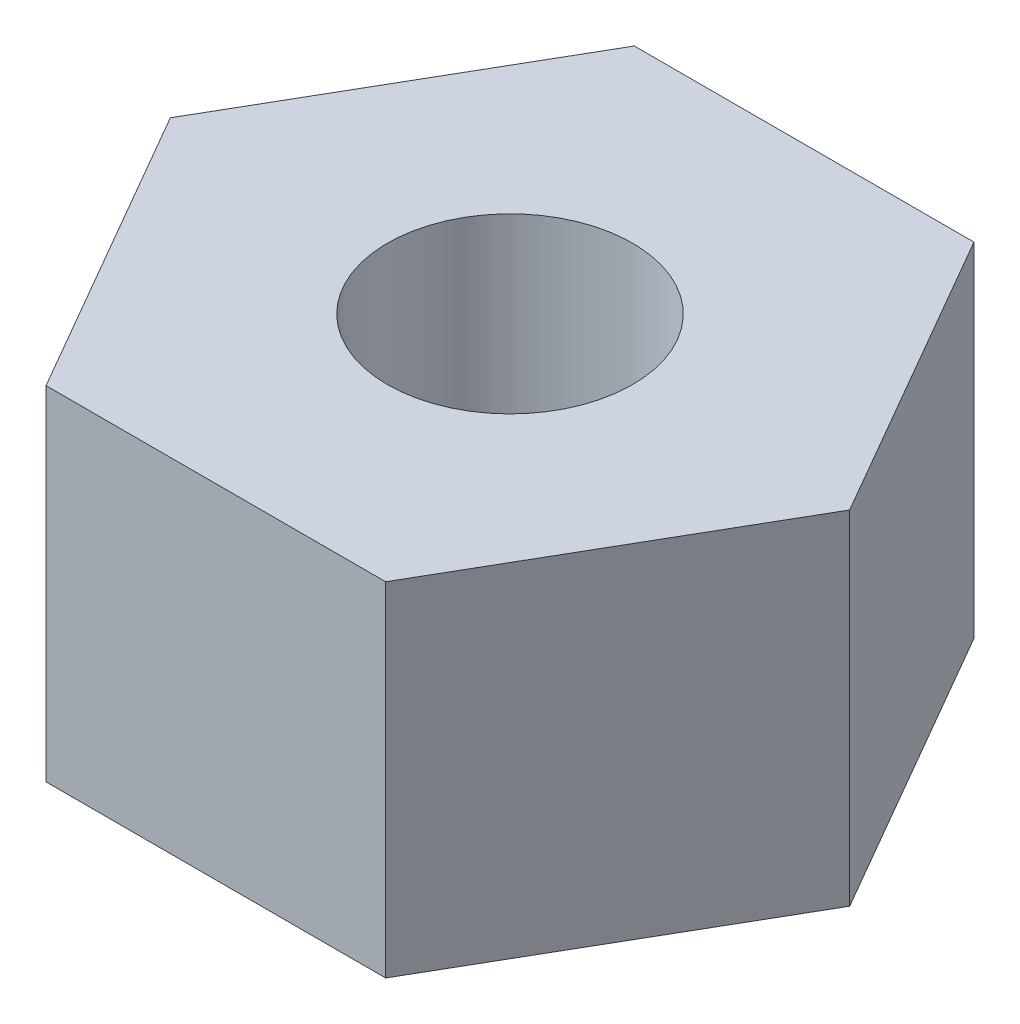
ISO-10303-21;
HEADER;
FILE_DESCRIPTION(('STEP AP214'),'2;1');
FILE_NAME('part.step','',(''),(''),'','','');
FILE_SCHEMA(('AUTOMOTIVE_DESIGN { 1 0 10303 214 1 1 1 1 }'));
ENDSEC;
DATA;
#1=APPLICATION_CONTEXT('core data for automotive mechanical design processes');
#2=APPLICATION_PROTOCOL_DEFINITION('international standard','automotive_design',2000,#1);
#3=PRODUCT_CONTEXT('',#1,'mechanical');
#4=PRODUCT('Part','Part','',(#3));
#5=PRODUCT_RELATED_PRODUCT_CATEGORY('part','',(#4));
#6=PRODUCT_DEFINITION_FORMATION('','',#4);
#7=PRODUCT_DEFINITION_CONTEXT('part definition',#1,'design');
#8=PRODUCT_DEFINITION('design','',#6,#7);
#9=PRODUCT_DEFINITION_SHAPE('','',#8);
#10=(LENGTH_UNIT() NAMED_UNIT(*) SI_UNIT(.MILLI.,.METRE.));
#11=(NAMED_UNIT(*) PLANE_ANGLE_UNIT() SI_UNIT($,.RADIAN.));
#12=(NAMED_UNIT(*) SI_UNIT($,.STERADIAN.) SOLID_ANGLE_UNIT());
#13=UNCERTAINTY_MEASURE_WITH_UNIT(LENGTH_MEASURE(1.E-05),#10,'distance_accuracy_value','');
#14=(GEOMETRIC_REPRESENTATION_CONTEXT(3) GLOBAL_UNCERTAINTY_ASSIGNED_CONTEXT((#13)) GLOBAL_UNIT_ASSIGNED_CONTEXT((#10,
#11,#12)) REPRESENTATION_CONTEXT('',''));
#15=CARTESIAN_POINT('',(0.,0.,0.));
#16=DIRECTION('',(0.,0.,1.));
#17=DIRECTION('',(1.,0.,0.));
#18=AXIS2_PLACEMENT_3D('',#15,#16,#17);
#19=CARTESIAN_POINT('',(0.,3.5,0.));
#20=DIRECTION('',(0.,1.,0.));
#21=DIRECTION('',(0.,0.,1.));
#22=AXIS2_PLACEMENT_3D('',#19,#20,#21);
#23=PLANE('',#22);
#24=DIRECTION('',(0.499999999999995,0.,-0.866025403784442));
#25=VECTOR('',#24,1.);
#26=CARTESIAN_POINT('',(1.73205080756891,3.5,2.99999999999998));
#27=LINE('',#26,#25);
#28=CARTESIAN_POINT('',(1.73205080756891,3.5,2.99999999999998));
#29=VERTEX_POINT('',#28);
#30=CARTESIAN_POINT('',(3.46410161513776,3.5,0.));
#31=VERTEX_POINT('',#30);
#32=EDGE_CURVE('E146',#29,#31,#27,.T.);
#33=ORIENTED_EDGE('',*,*,#32,.T.);
#34=DIRECTION('',(-0.500000000000001,0.,-0.866025403784438));
#35=VECTOR('',#34,1.);
#36=CARTESIAN_POINT('',(3.46410161513776,3.5,0.));
#37=LINE('',#36,#35);
#38=CARTESIAN_POINT('',(1.73205080756887,3.5,-3.00000000000001));
#39=VERTEX_POINT('',#38);
#40=EDGE_CURVE('E94',#31,#39,#37,.T.);
#41=ORIENTED_EDGE('',*,*,#40,.T.);
#42=DIRECTION('',(-1.,0.,0.));
#43=VECTOR('',#42,1.);
#44=CARTESIAN_POINT('',(1.73205080756887,3.5,-3.00000000000001));
#45=LINE('',#44,#43);
#46=CARTESIAN_POINT('',(-1.73205080756889,3.5,-2.99999999999999));
#47=VERTEX_POINT('',#46);
#48=EDGE_CURVE('E107',#39,#47,#45,.T.);
#49=ORIENTED_EDGE('',*,*,#48,.T.);
#50=DIRECTION('',(-0.499999999999995,0.,0.866025403784442));
#51=VECTOR('',#50,1.);
#52=CARTESIAN_POINT('',(-1.73205080756889,3.5,-2.99999999999999));
#53=LINE('',#52,#51);
#54=CARTESIAN_POINT('',(-3.46410161513776,3.5,0.));
#55=VERTEX_POINT('',#54);
#56=EDGE_CURVE('E101',#47,#55,#53,.T.);
#57=ORIENTED_EDGE('',*,*,#56,.T.);
#58=DIRECTION('',(0.500000000000007,0.,0.866025403784435));
#59=VECTOR('',#58,1.);
#60=CARTESIAN_POINT('',(-3.46410161513776,3.5,0.));
#61=LINE('',#60,#59);
#62=CARTESIAN_POINT('',(-1.73205080756885,3.5,3.00000000000002));
#63=VERTEX_POINT('',#62);
#64=EDGE_CURVE('E105',#55,#63,#61,.T.);
#65=ORIENTED_EDGE('',*,*,#64,.T.);
#66=DIRECTION('',(1.,0.,0.));
#67=VECTOR('',#66,1.);
#68=CARTESIAN_POINT('',(-1.73205080756885,3.5,3.00000000000002));
#69=LINE('',#68,#67);
#70=EDGE_CURVE('E57',#63,#29,#69,.T.);
#71=ORIENTED_EDGE('',*,*,#70,.T.);
#72=EDGE_LOOP('',(#33,#41,#49,#57,#65,#71));
#73=FACE_BOUND('',#72,.T.);
#74=CARTESIAN_POINT('',(0.,3.5,0.));
#75=DIRECTION('',(0.,1.,0.));
#76=DIRECTION('',(0.,0.,1.));
#77=AXIS2_PLACEMENT_3D('',#74,#75,#76);
#78=CIRCLE('',#77,1.25);
#79=CARTESIAN_POINT('',(0.,3.5,1.25));
#80=VERTEX_POINT('',#79);
#81=EDGE_CURVE('E134',#80,#80,#78,.T.);
#82=ORIENTED_EDGE('',*,*,#81,.F.);
#83=EDGE_LOOP('',(#82));
#84=FACE_BOUND('',#83,.T.);
#85=ADVANCED_FACE('F39',(#73,#84),#23,.T.);
#86=CARTESIAN_POINT('',(0.,0.,0.));
#87=DIRECTION('',(0.,1.,0.));
#88=DIRECTION('',(0.,0.,1.));
#89=AXIS2_PLACEMENT_3D('',#86,#87,#88);
#90=PLANE('',#89);
#91=DIRECTION('',(0.499999999999995,0.,-0.866025403784442));
#92=VECTOR('',#91,1.);
#93=CARTESIAN_POINT('',(1.73205080756891,0.,2.99999999999998));
#94=LINE('',#93,#92);
#95=CARTESIAN_POINT('',(1.73205080756891,0.,2.99999999999998));
#96=VERTEX_POINT('',#95);
#97=CARTESIAN_POINT('',(3.46410161513776,0.,0.));
#98=VERTEX_POINT('',#97);
#99=EDGE_CURVE('E129',#96,#98,#94,.T.);
#100=ORIENTED_EDGE('',*,*,#99,.F.);
#101=DIRECTION('',(1.,0.,0.));
#102=VECTOR('',#101,1.);
#103=CARTESIAN_POINT('',(-1.73205080756885,0.,3.00000000000002));
#104=LINE('',#103,#102);
#105=CARTESIAN_POINT('',(-1.73205080756885,0.,3.00000000000002));
#106=VERTEX_POINT('',#105);
#107=EDGE_CURVE('E86',#106,#96,#104,.T.);
#108=ORIENTED_EDGE('',*,*,#107,.F.);
#109=DIRECTION('',(0.500000000000007,0.,0.866025403784435));
#110=VECTOR('',#109,1.);
#111=CARTESIAN_POINT('',(-3.46410161513776,0.,0.));
#112=LINE('',#111,#110);
#113=CARTESIAN_POINT('',(-3.46410161513776,0.,0.));
#114=VERTEX_POINT('',#113);
#115=EDGE_CURVE('E80',#114,#106,#112,.T.);
#116=ORIENTED_EDGE('',*,*,#115,.F.);
#117=DIRECTION('',(-0.499999999999995,0.,0.866025403784442));
#118=VECTOR('',#117,1.);
#119=CARTESIAN_POINT('',(-1.73205080756889,0.,-2.99999999999999));
#120=LINE('',#119,#118);
#121=CARTESIAN_POINT('',(-1.73205080756889,0.,-2.99999999999999));
#122=VERTEX_POINT('',#121);
#123=EDGE_CURVE('E116',#122,#114,#120,.T.);
#124=ORIENTED_EDGE('',*,*,#123,.F.);
#125=DIRECTION('',(-1.,0.,0.));
#126=VECTOR('',#125,1.);
#127=CARTESIAN_POINT('',(1.73205080756887,0.,-3.00000000000001));
#128=LINE('',#127,#126);
#129=CARTESIAN_POINT('',(1.73205080756887,0.,-3.00000000000001));
#130=VERTEX_POINT('',#129);
#131=EDGE_CURVE('E137',#130,#122,#128,.T.);
#132=ORIENTED_EDGE('',*,*,#131,.F.);
#133=DIRECTION('',(-0.500000000000001,0.,-0.866025403784438));
#134=VECTOR('',#133,1.);
#135=CARTESIAN_POINT('',(3.46410161513776,0.,0.));
#136=LINE('',#135,#134);
#137=EDGE_CURVE('E133',#98,#130,#136,.T.);
#138=ORIENTED_EDGE('',*,*,#137,.F.);
#139=EDGE_LOOP('',(#100,#108,#116,#124,#132,#138));
#140=FACE_BOUND('',#139,.T.);
#141=CARTESIAN_POINT('',(0.,0.,0.));
#142=DIRECTION('',(0.,1.,0.));
#143=DIRECTION('',(0.,0.,1.));
#144=AXIS2_PLACEMENT_3D('',#141,#142,#143);
#145=CIRCLE('',#144,1.25);
#146=CARTESIAN_POINT('',(0.,0.,1.25));
#147=VERTEX_POINT('',#146);
#148=EDGE_CURVE('E243',#147,#147,#145,.T.);
#149=ORIENTED_EDGE('',*,*,#148,.T.);
#150=EDGE_LOOP('',(#149));
#151=FACE_BOUND('',#150,.T.);
#152=ADVANCED_FACE('F159',(#140,#151),#90,.F.);
#153=CARTESIAN_POINT('',(1.73205080756891,3.5,2.99999999999998));
#154=DIRECTION('',(-0.866025403784442,0.,-0.499999999999995));
#155=DIRECTION('',(-0.499999999999995,0.,0.866025403784442));
#156=AXIS2_PLACEMENT_3D('',#153,#154,#155);
#157=PLANE('',#156);
#158=ORIENTED_EDGE('',*,*,#99,.T.);
#159=DIRECTION('',(0.,-1.,0.));
#160=VECTOR('',#159,1.);
#161=CARTESIAN_POINT('',(3.46410161513776,3.5,0.));
#162=LINE('',#161,#160);
#163=EDGE_CURVE('E11',#31,#98,#162,.T.);
#164=ORIENTED_EDGE('',*,*,#163,.F.);
#165=ORIENTED_EDGE('',*,*,#32,.F.);
#166=DIRECTION('',(0.,-1.,0.));
#167=VECTOR('',#166,1.);
#168=CARTESIAN_POINT('',(1.73205080756891,3.5,2.99999999999998));
#169=LINE('',#168,#167);
#170=EDGE_CURVE('E125',#29,#96,#169,.T.);
#171=ORIENTED_EDGE('',*,*,#170,.T.);
#172=EDGE_LOOP('',(#158,#164,#165,#171));
#173=FACE_BOUND('',#172,.T.);
#174=ADVANCED_FACE('F41',(#173),#157,.F.);
#175=CARTESIAN_POINT('',(3.46410161513776,3.5,0.));
#176=DIRECTION('',(-0.866025403784438,0.,0.500000000000001));
#177=DIRECTION('',(0.500000000000001,0.,0.866025403784438));
#178=AXIS2_PLACEMENT_3D('',#175,#176,#177);
#179=PLANE('',#178);
#180=ORIENTED_EDGE('',*,*,#137,.T.);
#181=DIRECTION('',(0.,-1.,0.));
#182=VECTOR('',#181,1.);
#183=CARTESIAN_POINT('',(1.73205080756887,3.5,-3.00000000000001));
#184=LINE('',#183,#182);
#185=EDGE_CURVE('E49',#39,#130,#184,.T.);
#186=ORIENTED_EDGE('',*,*,#185,.F.);
#187=ORIENTED_EDGE('',*,*,#40,.F.);
#188=ORIENTED_EDGE('',*,*,#163,.T.);
#189=EDGE_LOOP('',(#180,#186,#187,#188));
#190=FACE_BOUND('',#189,.T.);
#191=ADVANCED_FACE('F184',(#190),#179,.F.);
#192=CARTESIAN_POINT('',(1.73205080756887,3.5,-3.00000000000001));
#193=DIRECTION('',(0.,0.,1.));
#194=DIRECTION('',(1.,0.,0.));
#195=AXIS2_PLACEMENT_3D('',#192,#193,#194);
#196=PLANE('',#195);
#197=ORIENTED_EDGE('',*,*,#131,.T.);
#198=DIRECTION('',(0.,-1.,0.));
#199=VECTOR('',#198,1.);
#200=CARTESIAN_POINT('',(-1.73205080756889,3.5,-2.99999999999999));
#201=LINE('',#200,#199);
#202=EDGE_CURVE('E118',#47,#122,#201,.T.);
#203=ORIENTED_EDGE('',*,*,#202,.F.);
#204=ORIENTED_EDGE('',*,*,#48,.F.);
#205=ORIENTED_EDGE('',*,*,#185,.T.);
#206=EDGE_LOOP('',(#197,#203,#204,#205));
#207=FACE_BOUND('',#206,.T.);
#208=ADVANCED_FACE('F156',(#207),#196,.F.);
#209=CARTESIAN_POINT('',(-1.73205080756889,3.5,-2.99999999999999));
#210=DIRECTION('',(0.866025403784442,0.,0.499999999999995));
#211=DIRECTION('',(0.499999999999995,0.,-0.866025403784442));
#212=AXIS2_PLACEMENT_3D('',#209,#210,#211);
#213=PLANE('',#212);
#214=ORIENTED_EDGE('',*,*,#123,.T.);
#215=DIRECTION('',(0.,-1.,0.));
#216=VECTOR('',#215,1.);
#217=CARTESIAN_POINT('',(-3.46410161513776,3.5,0.));
#218=LINE('',#217,#216);
#219=EDGE_CURVE('E113',#55,#114,#218,.T.);
#220=ORIENTED_EDGE('',*,*,#219,.F.);
#221=ORIENTED_EDGE('',*,*,#56,.F.);
#222=ORIENTED_EDGE('',*,*,#202,.T.);
#223=EDGE_LOOP('',(#214,#220,#221,#222));
#224=FACE_BOUND('',#223,.T.);
#225=ADVANCED_FACE('F114',(#224),#213,.F.);
#226=CARTESIAN_POINT('',(-3.46410161513776,3.5,0.));
#227=DIRECTION('',(0.866025403784435,0.,-0.500000000000007));
#228=DIRECTION('',(-0.500000000000007,0.,-0.866025403784435));
#229=AXIS2_PLACEMENT_3D('',#226,#227,#228);
#230=PLANE('',#229);
#231=ORIENTED_EDGE('',*,*,#115,.T.);
#232=DIRECTION('',(0.,-1.,0.));
#233=VECTOR('',#232,1.);
#234=CARTESIAN_POINT('',(-1.73205080756885,3.5,3.00000000000002));
#235=LINE('',#234,#233);
#236=EDGE_CURVE('E119',#63,#106,#235,.T.);
#237=ORIENTED_EDGE('',*,*,#236,.F.);
#238=ORIENTED_EDGE('',*,*,#64,.F.);
#239=ORIENTED_EDGE('',*,*,#219,.T.);
#240=EDGE_LOOP('',(#231,#237,#238,#239));
#241=FACE_BOUND('',#240,.T.);
#242=ADVANCED_FACE('F121',(#241),#230,.F.);
#243=CARTESIAN_POINT('',(-1.73205080756885,3.5,3.00000000000002));
#244=DIRECTION('',(0.,0.,-1.));
#245=DIRECTION('',(-1.,0.,0.));
#246=AXIS2_PLACEMENT_3D('',#243,#244,#245);
#247=PLANE('',#246);
#248=ORIENTED_EDGE('',*,*,#107,.T.);
#249=ORIENTED_EDGE('',*,*,#170,.F.);
#250=ORIENTED_EDGE('',*,*,#70,.F.);
#251=ORIENTED_EDGE('',*,*,#236,.T.);
#252=EDGE_LOOP('',(#248,#249,#250,#251));
#253=FACE_BOUND('',#252,.T.);
#254=ADVANCED_FACE('F164',(#253),#247,.F.);
#255=CARTESIAN_POINT('',(0.,3.5,0.));
#256=DIRECTION('',(0.,-1.,0.));
#257=DIRECTION('',(0.,0.,-1.));
#258=AXIS2_PLACEMENT_3D('',#255,#256,#257);
#259=CYLINDRICAL_SURFACE('',#258,1.25);
#260=ORIENTED_EDGE('',*,*,#81,.T.);
#261=EDGE_LOOP('',(#260));
#262=FACE_BOUND('',#261,.T.);
#263=ORIENTED_EDGE('',*,*,#148,.F.);
#264=EDGE_LOOP('',(#263));
#265=FACE_BOUND('',#264,.T.);
#266=ADVANCED_FACE('F166',(#262,#265),#259,.F.);
#267=CLOSED_SHELL('',(#85,#152,#174,#191,#208,#225,#242,#254,#266));
#268=MANIFOLD_SOLID_BREP('B2',#267);
#269=ADVANCED_BREP_SHAPE_REPRESENTATION('',(#18,#268),#14);
#270=SHAPE_DEFINITION_REPRESENTATION(#9,#269);
ENDSEC;
END-ISO-10303-21;
